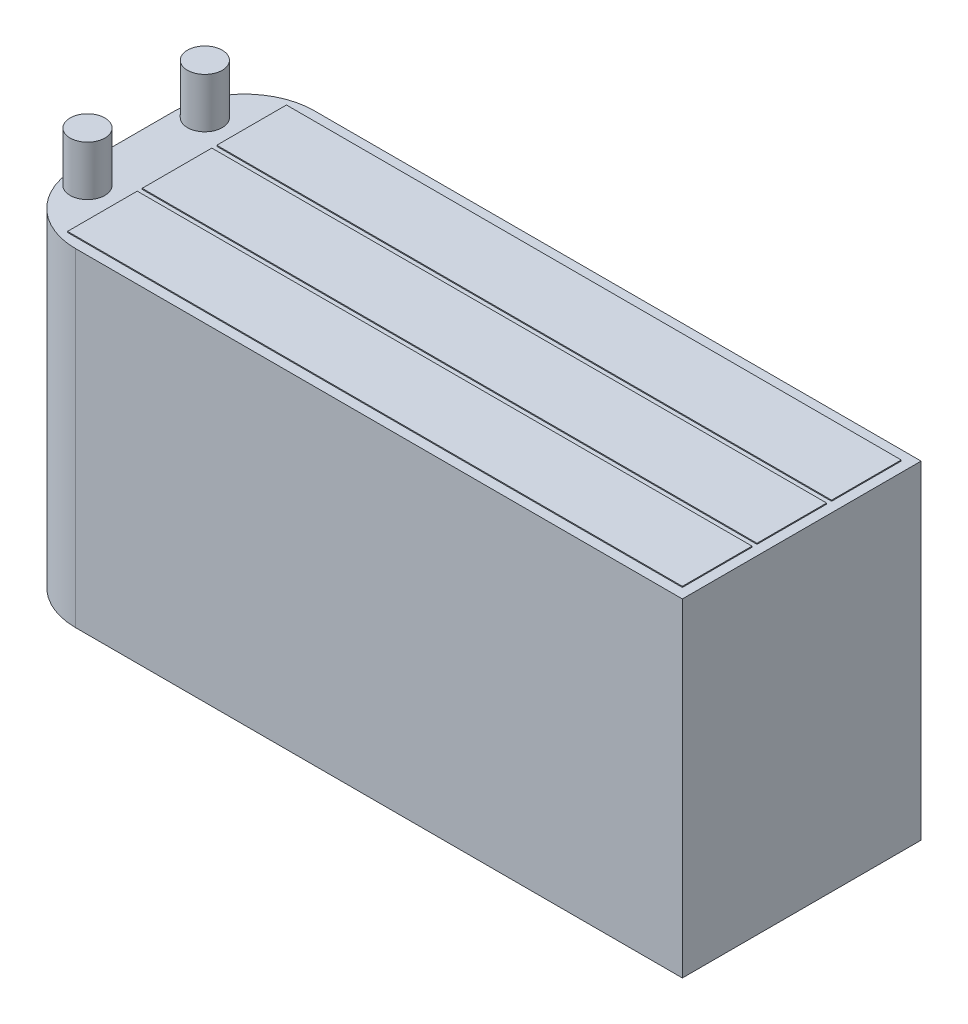
ISO-10303-21;
HEADER;
FILE_DESCRIPTION(('STEP AP214'),'2;1');
FILE_NAME('part.step','',(''),(''),'','','');
FILE_SCHEMA(('AUTOMOTIVE_DESIGN { 1 0 10303 214 1 1 1 1 }'));
ENDSEC;
DATA;
#1=APPLICATION_CONTEXT('core data for automotive mechanical design processes');
#2=APPLICATION_PROTOCOL_DEFINITION('international standard','automotive_design',2000,#1);
#3=PRODUCT_CONTEXT('',#1,'mechanical');
#4=PRODUCT('Part','Part','',(#3));
#5=PRODUCT_RELATED_PRODUCT_CATEGORY('part','',(#4));
#6=PRODUCT_DEFINITION_FORMATION('','',#4);
#7=PRODUCT_DEFINITION_CONTEXT('part definition',#1,'design');
#8=PRODUCT_DEFINITION('design','',#6,#7);
#9=PRODUCT_DEFINITION_SHAPE('','',#8);
#10=(LENGTH_UNIT() NAMED_UNIT(*) SI_UNIT(.MILLI.,.METRE.));
#11=(NAMED_UNIT(*) PLANE_ANGLE_UNIT() SI_UNIT($,.RADIAN.));
#12=(NAMED_UNIT(*) SI_UNIT($,.STERADIAN.) SOLID_ANGLE_UNIT());
#13=UNCERTAINTY_MEASURE_WITH_UNIT(LENGTH_MEASURE(1.E-05),#10,'distance_accuracy_value','');
#14=(GEOMETRIC_REPRESENTATION_CONTEXT(3) GLOBAL_UNCERTAINTY_ASSIGNED_CONTEXT((#13)) GLOBAL_UNIT_ASSIGNED_CONTEXT((#10,
#11,#12)) REPRESENTATION_CONTEXT('',''));
#15=CARTESIAN_POINT('',(0.,0.,0.));
#16=DIRECTION('',(0.,0.,1.));
#17=DIRECTION('',(1.,0.,0.));
#18=AXIS2_PLACEMENT_3D('',#15,#16,#17);
#19=CARTESIAN_POINT('',(33.,-16.6,1.));
#20=DIRECTION('',(-1.,0.,0.));
#21=DIRECTION('',(0.,0.,1.));
#22=AXIS2_PLACEMENT_3D('',#19,#20,#21);
#23=PLANE('',#22);
#24=DIRECTION('',(0.,0.,-1.));
#25=VECTOR('',#24,1.);
#26=CARTESIAN_POINT('',(33.,-16.5,1.));
#27=LINE('',#26,#25);
#28=CARTESIAN_POINT('',(33.,-16.5,8.));
#29=VERTEX_POINT('',#28);
#30=CARTESIAN_POINT('',(33.,-16.5,1.));
#31=VERTEX_POINT('',#30);
#32=EDGE_CURVE('E120',#29,#31,#27,.T.);
#33=ORIENTED_EDGE('',*,*,#32,.F.);
#34=DIRECTION('',(0.,1.,0.));
#35=VECTOR('',#34,1.);
#36=CARTESIAN_POINT('',(33.,-16.6,8.));
#37=LINE('',#36,#35);
#38=CARTESIAN_POINT('',(33.,-16.6,8.));
#39=VERTEX_POINT('',#38);
#40=EDGE_CURVE('E116',#39,#29,#37,.T.);
#41=ORIENTED_EDGE('',*,*,#40,.F.);
#42=DIRECTION('',(0.,0.,-1.));
#43=VECTOR('',#42,1.);
#44=CARTESIAN_POINT('',(33.,-16.6,1.));
#45=LINE('',#44,#43);
#46=CARTESIAN_POINT('',(33.,-16.6,1.));
#47=VERTEX_POINT('',#46);
#48=EDGE_CURVE('E113',#39,#47,#45,.T.);
#49=ORIENTED_EDGE('',*,*,#48,.T.);
#50=DIRECTION('',(0.,1.,0.));
#51=VECTOR('',#50,1.);
#52=CARTESIAN_POINT('',(33.,-16.6,1.));
#53=LINE('',#52,#51);
#54=EDGE_CURVE('E12',#47,#31,#53,.T.);
#55=ORIENTED_EDGE('',*,*,#54,.T.);
#56=EDGE_LOOP('',(#33,#41,#49,#55));
#57=FACE_BOUND('',#56,.T.);
#58=ADVANCED_FACE('F53',(#57),#23,.F.);
#59=CARTESIAN_POINT('',(33.,-16.6,1.));
#60=DIRECTION('',(0.,0.,1.));
#61=DIRECTION('',(1.,0.,0.));
#62=AXIS2_PLACEMENT_3D('',#59,#60,#61);
#63=PLANE('',#62);
#64=DIRECTION('',(-1.,0.,0.));
#65=VECTOR('',#64,1.);
#66=CARTESIAN_POINT('',(33.,-16.5,1.));
#67=LINE('',#66,#65);
#68=CARTESIAN_POINT('',(-28.7999999999999,-16.5,1.));
#69=VERTEX_POINT('',#68);
#70=EDGE_CURVE('E117',#31,#69,#67,.T.);
#71=ORIENTED_EDGE('',*,*,#70,.F.);
#72=ORIENTED_EDGE('',*,*,#54,.F.);
#73=DIRECTION('',(-1.,0.,0.));
#74=VECTOR('',#73,1.);
#75=CARTESIAN_POINT('',(33.,-16.6,1.));
#76=LINE('',#75,#74);
#77=CARTESIAN_POINT('',(-28.7999999999999,-16.6,1.));
#78=VERTEX_POINT('',#77);
#79=EDGE_CURVE('E92',#47,#78,#76,.T.);
#80=ORIENTED_EDGE('',*,*,#79,.T.);
#81=DIRECTION('',(0.,1.,0.));
#82=VECTOR('',#81,1.);
#83=CARTESIAN_POINT('',(-28.7999999999999,-16.6,1.));
#84=LINE('',#83,#82);
#85=EDGE_CURVE('E65',#78,#69,#84,.T.);
#86=ORIENTED_EDGE('',*,*,#85,.T.);
#87=EDGE_LOOP('',(#71,#72,#80,#86));
#88=FACE_BOUND('',#87,.T.);
#89=ADVANCED_FACE('F110',(#88),#63,.F.);
#90=CARTESIAN_POINT('',(-28.7999999999999,-16.6,1.));
#91=DIRECTION('',(1.,0.,0.));
#92=DIRECTION('',(0.,0.,-1.));
#93=AXIS2_PLACEMENT_3D('',#90,#91,#92);
#94=PLANE('',#93);
#95=DIRECTION('',(0.,0.,1.));
#96=VECTOR('',#95,1.);
#97=CARTESIAN_POINT('',(-28.7999999999999,-16.5,1.));
#98=LINE('',#97,#96);
#99=CARTESIAN_POINT('',(-28.7999999999999,-16.5,8.));
#100=VERTEX_POINT('',#99);
#101=EDGE_CURVE('E102',#69,#100,#98,.T.);
#102=ORIENTED_EDGE('',*,*,#101,.F.);
#103=ORIENTED_EDGE('',*,*,#85,.F.);
#104=DIRECTION('',(0.,0.,1.));
#105=VECTOR('',#104,1.);
#106=CARTESIAN_POINT('',(-28.7999999999999,-16.6,1.));
#107=LINE('',#106,#105);
#108=CARTESIAN_POINT('',(-28.7999999999999,-16.6,8.));
#109=VERTEX_POINT('',#108);
#110=EDGE_CURVE('E97',#78,#109,#107,.T.);
#111=ORIENTED_EDGE('',*,*,#110,.T.);
#112=DIRECTION('',(0.,1.,0.));
#113=VECTOR('',#112,1.);
#114=CARTESIAN_POINT('',(-28.7999999999999,-16.6,8.));
#115=LINE('',#114,#113);
#116=EDGE_CURVE('E106',#109,#100,#115,.T.);
#117=ORIENTED_EDGE('',*,*,#116,.T.);
#118=EDGE_LOOP('',(#102,#103,#111,#117));
#119=FACE_BOUND('',#118,.T.);
#120=ADVANCED_FACE('F104',(#119),#94,.F.);
#121=CARTESIAN_POINT('',(33.,-16.6,8.));
#122=DIRECTION('',(0.,0.,-1.));
#123=DIRECTION('',(-1.,0.,0.));
#124=AXIS2_PLACEMENT_3D('',#121,#122,#123);
#125=PLANE('',#124);
#126=DIRECTION('',(1.,0.,0.));
#127=VECTOR('',#126,1.);
#128=CARTESIAN_POINT('',(33.,-16.5,8.));
#129=LINE('',#128,#127);
#130=EDGE_CURVE('E84',#100,#29,#129,.T.);
#131=ORIENTED_EDGE('',*,*,#130,.F.);
#132=ORIENTED_EDGE('',*,*,#116,.F.);
#133=DIRECTION('',(1.,0.,0.));
#134=VECTOR('',#133,1.);
#135=CARTESIAN_POINT('',(33.,-16.6,8.));
#136=LINE('',#135,#134);
#137=EDGE_CURVE('E67',#109,#39,#136,.T.);
#138=ORIENTED_EDGE('',*,*,#137,.T.);
#139=ORIENTED_EDGE('',*,*,#40,.T.);
#140=EDGE_LOOP('',(#131,#132,#138,#139));
#141=FACE_BOUND('',#140,.T.);
#142=ADVANCED_FACE('F127',(#141),#125,.F.);
#143=CARTESIAN_POINT('',(0.,-16.6,0.));
#144=DIRECTION('',(0.,1.,0.));
#145=DIRECTION('',(0.,0.,-1.));
#146=AXIS2_PLACEMENT_3D('',#143,#144,#145);
#147=PLANE('',#146);
#148=ORIENTED_EDGE('',*,*,#48,.F.);
#149=ORIENTED_EDGE('',*,*,#137,.F.);
#150=ORIENTED_EDGE('',*,*,#110,.F.);
#151=ORIENTED_EDGE('',*,*,#79,.F.);
#152=EDGE_LOOP('',(#148,#149,#150,#151));
#153=FACE_BOUND('',#152,.T.);
#154=ADVANCED_FACE('F96',(#153),#147,.F.);
#155=CARTESIAN_POINT('',(0.,-16.5,0.));
#156=DIRECTION('',(0.,1.,0.));
#157=DIRECTION('',(0.,0.,-1.));
#158=AXIS2_PLACEMENT_3D('',#155,#156,#157);
#159=PLANE('',#158);
#160=ORIENTED_EDGE('',*,*,#32,.T.);
#161=ORIENTED_EDGE('',*,*,#70,.T.);
#162=ORIENTED_EDGE('',*,*,#101,.T.);
#163=ORIENTED_EDGE('',*,*,#130,.T.);
#164=EDGE_LOOP('',(#160,#161,#162,#163));
#165=FACE_BOUND('',#164,.T.);
#166=ADVANCED_FACE('F122',(#165),#159,.T.);
#167=CLOSED_SHELL('',(#58,#89,#120,#142,#154,#166));
#168=MANIFOLD_SOLID_BREP('B2',#167);
#169=CARTESIAN_POINT('',(33.,-16.6,8.5));
#170=DIRECTION('',(-1.,0.,0.));
#171=DIRECTION('',(0.,0.,1.));
#172=AXIS2_PLACEMENT_3D('',#169,#170,#171);
#173=PLANE('',#172);
#174=DIRECTION('',(0.,0.,-1.));
#175=VECTOR('',#174,1.);
#176=CARTESIAN_POINT('',(33.,-16.5,8.5));
#177=LINE('',#176,#175);
#178=CARTESIAN_POINT('',(33.,-16.5,15.5));
#179=VERTEX_POINT('',#178);
#180=CARTESIAN_POINT('',(33.,-16.5,8.5));
#181=VERTEX_POINT('',#180);
#182=EDGE_CURVE('E278',#179,#181,#177,.T.);
#183=ORIENTED_EDGE('',*,*,#182,.F.);
#184=DIRECTION('',(0.,1.,0.));
#185=VECTOR('',#184,1.);
#186=CARTESIAN_POINT('',(33.,-16.6,15.5));
#187=LINE('',#186,#185);
#188=CARTESIAN_POINT('',(33.,-16.6,15.5));
#189=VERTEX_POINT('',#188);
#190=EDGE_CURVE('E277',#189,#179,#187,.T.);
#191=ORIENTED_EDGE('',*,*,#190,.F.);
#192=DIRECTION('',(0.,0.,-1.));
#193=VECTOR('',#192,1.);
#194=CARTESIAN_POINT('',(33.,-16.6,8.5));
#195=LINE('',#194,#193);
#196=CARTESIAN_POINT('',(33.,-16.6,8.5));
#197=VERTEX_POINT('',#196);
#198=EDGE_CURVE('E273',#189,#197,#195,.T.);
#199=ORIENTED_EDGE('',*,*,#198,.T.);
#200=DIRECTION('',(0.,1.,0.));
#201=VECTOR('',#200,1.);
#202=CARTESIAN_POINT('',(33.,-16.6,8.5));
#203=LINE('',#202,#201);
#204=EDGE_CURVE('E55',#197,#181,#203,.T.);
#205=ORIENTED_EDGE('',*,*,#204,.T.);
#206=EDGE_LOOP('',(#183,#191,#199,#205));
#207=FACE_BOUND('',#206,.T.);
#208=ADVANCED_FACE('F219',(#207),#173,.F.);
#209=CARTESIAN_POINT('',(33.,-16.6,8.5));
#210=DIRECTION('',(0.,0.,1.));
#211=DIRECTION('',(1.,0.,0.));
#212=AXIS2_PLACEMENT_3D('',#209,#210,#211);
#213=PLANE('',#212);
#214=DIRECTION('',(-1.,0.,0.));
#215=VECTOR('',#214,1.);
#216=CARTESIAN_POINT('',(33.,-16.5,8.5));
#217=LINE('',#216,#215);
#218=CARTESIAN_POINT('',(-28.7999999999999,-16.5,8.5));
#219=VERTEX_POINT('',#218);
#220=EDGE_CURVE('E282',#181,#219,#217,.T.);
#221=ORIENTED_EDGE('',*,*,#220,.F.);
#222=ORIENTED_EDGE('',*,*,#204,.F.);
#223=DIRECTION('',(-1.,0.,0.));
#224=VECTOR('',#223,1.);
#225=CARTESIAN_POINT('',(33.,-16.6,8.5));
#226=LINE('',#225,#224);
#227=CARTESIAN_POINT('',(-28.7999999999999,-16.6,8.5));
#228=VERTEX_POINT('',#227);
#229=EDGE_CURVE('E257',#197,#228,#226,.T.);
#230=ORIENTED_EDGE('',*,*,#229,.T.);
#231=DIRECTION('',(0.,1.,0.));
#232=VECTOR('',#231,1.);
#233=CARTESIAN_POINT('',(-28.7999999999999,-16.6,8.5));
#234=LINE('',#233,#232);
#235=EDGE_CURVE('E225',#228,#219,#234,.T.);
#236=ORIENTED_EDGE('',*,*,#235,.T.);
#237=EDGE_LOOP('',(#221,#222,#230,#236));
#238=FACE_BOUND('',#237,.T.);
#239=ADVANCED_FACE('F271',(#238),#213,.F.);
#240=CARTESIAN_POINT('',(-28.7999999999999,-16.6,8.5));
#241=DIRECTION('',(1.,0.,0.));
#242=DIRECTION('',(0.,0.,-1.));
#243=AXIS2_PLACEMENT_3D('',#240,#241,#242);
#244=PLANE('',#243);
#245=DIRECTION('',(0.,0.,1.));
#246=VECTOR('',#245,1.);
#247=CARTESIAN_POINT('',(-28.7999999999999,-16.5,8.5));
#248=LINE('',#247,#246);
#249=CARTESIAN_POINT('',(-28.7999999999999,-16.5,15.5));
#250=VERTEX_POINT('',#249);
#251=EDGE_CURVE('E270',#219,#250,#248,.T.);
#252=ORIENTED_EDGE('',*,*,#251,.F.);
#253=ORIENTED_EDGE('',*,*,#235,.F.);
#254=DIRECTION('',(0.,0.,1.));
#255=VECTOR('',#254,1.);
#256=CARTESIAN_POINT('',(-28.7999999999999,-16.6,8.5));
#257=LINE('',#256,#255);
#258=CARTESIAN_POINT('',(-28.7999999999999,-16.6,15.5));
#259=VERTEX_POINT('',#258);
#260=EDGE_CURVE('E259',#228,#259,#257,.T.);
#261=ORIENTED_EDGE('',*,*,#260,.T.);
#262=DIRECTION('',(0.,1.,0.));
#263=VECTOR('',#262,1.);
#264=CARTESIAN_POINT('',(-28.7999999999999,-16.6,15.5));
#265=LINE('',#264,#263);
#266=EDGE_CURVE('E269',#259,#250,#265,.T.);
#267=ORIENTED_EDGE('',*,*,#266,.T.);
#268=EDGE_LOOP('',(#252,#253,#261,#267));
#269=FACE_BOUND('',#268,.T.);
#270=ADVANCED_FACE('F266',(#269),#244,.F.);
#271=CARTESIAN_POINT('',(33.,-16.6,15.5));
#272=DIRECTION('',(0.,0.,-1.));
#273=DIRECTION('',(-1.,0.,0.));
#274=AXIS2_PLACEMENT_3D('',#271,#272,#273);
#275=PLANE('',#274);
#276=DIRECTION('',(1.,0.,0.));
#277=VECTOR('',#276,1.);
#278=CARTESIAN_POINT('',(33.,-16.5,15.5));
#279=LINE('',#278,#277);
#280=EDGE_CURVE('E248',#250,#179,#279,.T.);
#281=ORIENTED_EDGE('',*,*,#280,.F.);
#282=ORIENTED_EDGE('',*,*,#266,.F.);
#283=DIRECTION('',(1.,0.,0.));
#284=VECTOR('',#283,1.);
#285=CARTESIAN_POINT('',(33.,-16.6,15.5));
#286=LINE('',#285,#284);
#287=EDGE_CURVE('E235',#259,#189,#286,.T.);
#288=ORIENTED_EDGE('',*,*,#287,.T.);
#289=ORIENTED_EDGE('',*,*,#190,.T.);
#290=EDGE_LOOP('',(#281,#282,#288,#289));
#291=FACE_BOUND('',#290,.T.);
#292=ADVANCED_FACE('F288',(#291),#275,.F.);
#293=CARTESIAN_POINT('',(0.,-16.6,0.));
#294=DIRECTION('',(0.,1.,0.));
#295=DIRECTION('',(0.,0.,-1.));
#296=AXIS2_PLACEMENT_3D('',#293,#294,#295);
#297=PLANE('',#296);
#298=ORIENTED_EDGE('',*,*,#198,.F.);
#299=ORIENTED_EDGE('',*,*,#287,.F.);
#300=ORIENTED_EDGE('',*,*,#260,.F.);
#301=ORIENTED_EDGE('',*,*,#229,.F.);
#302=EDGE_LOOP('',(#298,#299,#300,#301));
#303=FACE_BOUND('',#302,.T.);
#304=ADVANCED_FACE('F265',(#303),#297,.F.);
#305=CARTESIAN_POINT('',(0.,-16.5,0.));
#306=DIRECTION('',(0.,1.,0.));
#307=DIRECTION('',(0.,0.,-1.));
#308=AXIS2_PLACEMENT_3D('',#305,#306,#307);
#309=PLANE('',#308);
#310=ORIENTED_EDGE('',*,*,#182,.T.);
#311=ORIENTED_EDGE('',*,*,#220,.T.);
#312=ORIENTED_EDGE('',*,*,#251,.T.);
#313=ORIENTED_EDGE('',*,*,#280,.T.);
#314=EDGE_LOOP('',(#310,#311,#312,#313));
#315=FACE_BOUND('',#314,.T.);
#316=ADVANCED_FACE('F287',(#315),#309,.T.);
#317=CLOSED_SHELL('',(#208,#239,#270,#292,#304,#316));
#318=MANIFOLD_SOLID_BREP('B6',#317);
#319=CARTESIAN_POINT('',(-28.7999999999999,-16.6,16.));
#320=DIRECTION('',(1.,0.,0.));
#321=DIRECTION('',(0.,0.,-1.));
#322=AXIS2_PLACEMENT_3D('',#319,#320,#321);
#323=PLANE('',#322);
#324=DIRECTION('',(0.,0.,1.));
#325=VECTOR('',#324,1.);
#326=CARTESIAN_POINT('',(-28.7999999999999,-16.5,16.));
#327=LINE('',#326,#325);
#328=CARTESIAN_POINT('',(-28.7999999999999,-16.5,16.));
#329=VERTEX_POINT('',#328);
#330=CARTESIAN_POINT('',(-28.7999999999999,-16.5,23.));
#331=VERTEX_POINT('',#330);
#332=EDGE_CURVE('E444',#329,#331,#327,.T.);
#333=ORIENTED_EDGE('',*,*,#332,.F.);
#334=DIRECTION('',(0.,1.,0.));
#335=VECTOR('',#334,1.);
#336=CARTESIAN_POINT('',(-28.7999999999999,-16.6,16.));
#337=LINE('',#336,#335);
#338=CARTESIAN_POINT('',(-28.7999999999999,-16.6,16.));
#339=VERTEX_POINT('',#338);
#340=EDGE_CURVE('E438',#339,#329,#337,.T.);
#341=ORIENTED_EDGE('',*,*,#340,.F.);
#342=DIRECTION('',(0.,0.,1.));
#343=VECTOR('',#342,1.);
#344=CARTESIAN_POINT('',(-28.7999999999999,-16.6,16.));
#345=LINE('',#344,#343);
#346=CARTESIAN_POINT('',(-28.7999999999999,-16.6,23.));
#347=VERTEX_POINT('',#346);
#348=EDGE_CURVE('E433',#339,#347,#345,.T.);
#349=ORIENTED_EDGE('',*,*,#348,.T.);
#350=DIRECTION('',(0.,1.,0.));
#351=VECTOR('',#350,1.);
#352=CARTESIAN_POINT('',(-28.7999999999999,-16.6,23.));
#353=LINE('',#352,#351);
#354=EDGE_CURVE('E211',#347,#331,#353,.T.);
#355=ORIENTED_EDGE('',*,*,#354,.T.);
#356=EDGE_LOOP('',(#333,#341,#349,#355));
#357=FACE_BOUND('',#356,.T.);
#358=ADVANCED_FACE('F376',(#357),#323,.F.);
#359=CARTESIAN_POINT('',(-28.7999999999999,-16.6,23.));
#360=DIRECTION('',(0.,0.,-1.));
#361=DIRECTION('',(-1.,0.,0.));
#362=AXIS2_PLACEMENT_3D('',#359,#360,#361);
#363=PLANE('',#362);
#364=DIRECTION('',(1.,0.,0.));
#365=VECTOR('',#364,1.);
#366=CARTESIAN_POINT('',(-28.7999999999999,-16.5,23.));
#367=LINE('',#366,#365);
#368=CARTESIAN_POINT('',(33.,-16.5,23.));
#369=VERTEX_POINT('',#368);
#370=EDGE_CURVE('E445',#331,#369,#367,.T.);
#371=ORIENTED_EDGE('',*,*,#370,.F.);
#372=ORIENTED_EDGE('',*,*,#354,.F.);
#373=DIRECTION('',(1.,0.,0.));
#374=VECTOR('',#373,1.);
#375=CARTESIAN_POINT('',(-28.7999999999999,-16.6,23.));
#376=LINE('',#375,#374);
#377=CARTESIAN_POINT('',(33.,-16.6,23.));
#378=VERTEX_POINT('',#377);
#379=EDGE_CURVE('E417',#347,#378,#376,.T.);
#380=ORIENTED_EDGE('',*,*,#379,.T.);
#381=DIRECTION('',(0.,1.,0.));
#382=VECTOR('',#381,1.);
#383=CARTESIAN_POINT('',(33.,-16.6,23.));
#384=LINE('',#383,#382);
#385=EDGE_CURVE('E387',#378,#369,#384,.T.);
#386=ORIENTED_EDGE('',*,*,#385,.T.);
#387=EDGE_LOOP('',(#371,#372,#380,#386));
#388=FACE_BOUND('',#387,.T.);
#389=ADVANCED_FACE('F434',(#388),#363,.F.);
#390=CARTESIAN_POINT('',(33.,-16.6,16.));
#391=DIRECTION('',(-1.,0.,0.));
#392=DIRECTION('',(0.,0.,1.));
#393=AXIS2_PLACEMENT_3D('',#390,#391,#392);
#394=PLANE('',#393);
#395=DIRECTION('',(0.,0.,-1.));
#396=VECTOR('',#395,1.);
#397=CARTESIAN_POINT('',(33.,-16.5,16.));
#398=LINE('',#397,#396);
#399=CARTESIAN_POINT('',(33.,-16.5,16.));
#400=VERTEX_POINT('',#399);
#401=EDGE_CURVE('E428',#369,#400,#398,.T.);
#402=ORIENTED_EDGE('',*,*,#401,.F.);
#403=ORIENTED_EDGE('',*,*,#385,.F.);
#404=DIRECTION('',(0.,0.,-1.));
#405=VECTOR('',#404,1.);
#406=CARTESIAN_POINT('',(33.,-16.6,16.));
#407=LINE('',#406,#405);
#408=CARTESIAN_POINT('',(33.,-16.6,16.));
#409=VERTEX_POINT('',#408);
#410=EDGE_CURVE('E425',#378,#409,#407,.T.);
#411=ORIENTED_EDGE('',*,*,#410,.T.);
#412=DIRECTION('',(0.,1.,0.));
#413=VECTOR('',#412,1.);
#414=CARTESIAN_POINT('',(33.,-16.6,16.));
#415=LINE('',#414,#413);
#416=EDGE_CURVE('E435',#409,#400,#415,.T.);
#417=ORIENTED_EDGE('',*,*,#416,.T.);
#418=EDGE_LOOP('',(#402,#403,#411,#417));
#419=FACE_BOUND('',#418,.T.);
#420=ADVANCED_FACE('F427',(#419),#394,.F.);
#421=CARTESIAN_POINT('',(-28.7999999999999,-16.6,16.));
#422=DIRECTION('',(0.,0.,1.));
#423=DIRECTION('',(1.,0.,0.));
#424=AXIS2_PLACEMENT_3D('',#421,#422,#423);
#425=PLANE('',#424);
#426=DIRECTION('',(-1.,0.,0.));
#427=VECTOR('',#426,1.);
#428=CARTESIAN_POINT('',(-28.7999999999999,-16.5,16.));
#429=LINE('',#428,#427);
#430=EDGE_CURVE('E406',#400,#329,#429,.T.);
#431=ORIENTED_EDGE('',*,*,#430,.F.);
#432=ORIENTED_EDGE('',*,*,#416,.F.);
#433=DIRECTION('',(-1.,0.,0.));
#434=VECTOR('',#433,1.);
#435=CARTESIAN_POINT('',(-28.7999999999999,-16.6,16.));
#436=LINE('',#435,#434);
#437=EDGE_CURVE('E393',#409,#339,#436,.T.);
#438=ORIENTED_EDGE('',*,*,#437,.T.);
#439=ORIENTED_EDGE('',*,*,#340,.T.);
#440=EDGE_LOOP('',(#431,#432,#438,#439));
#441=FACE_BOUND('',#440,.T.);
#442=ADVANCED_FACE('F455',(#441),#425,.F.);
#443=CARTESIAN_POINT('',(0.,-16.6,0.));
#444=DIRECTION('',(0.,-1.,0.));
#445=DIRECTION('',(0.,0.,1.));
#446=AXIS2_PLACEMENT_3D('',#443,#444,#445);
#447=PLANE('',#446);
#448=ORIENTED_EDGE('',*,*,#348,.F.);
#449=ORIENTED_EDGE('',*,*,#437,.F.);
#450=ORIENTED_EDGE('',*,*,#410,.F.);
#451=ORIENTED_EDGE('',*,*,#379,.F.);
#452=EDGE_LOOP('',(#448,#449,#450,#451));
#453=FACE_BOUND('',#452,.T.);
#454=ADVANCED_FACE('F422',(#453),#447,.T.);
#455=CARTESIAN_POINT('',(0.,-16.5,0.));
#456=DIRECTION('',(0.,-1.,0.));
#457=DIRECTION('',(0.,0.,1.));
#458=AXIS2_PLACEMENT_3D('',#455,#456,#457);
#459=PLANE('',#458);
#460=ORIENTED_EDGE('',*,*,#332,.T.);
#461=ORIENTED_EDGE('',*,*,#370,.T.);
#462=ORIENTED_EDGE('',*,*,#401,.T.);
#463=ORIENTED_EDGE('',*,*,#430,.T.);
#464=EDGE_LOOP('',(#460,#461,#462,#463));
#465=FACE_BOUND('',#464,.T.);
#466=ADVANCED_FACE('F447',(#465),#459,.F.);
#467=CLOSED_SHELL('',(#358,#389,#420,#442,#454,#466));
#468=MANIFOLD_SOLID_BREP('B46',#467);
#469=CARTESIAN_POINT('',(-28.7999999999999,16.6,16.));
#470=DIRECTION('',(1.,0.,0.));
#471=DIRECTION('',(0.,0.,-1.));
#472=AXIS2_PLACEMENT_3D('',#469,#470,#471);
#473=PLANE('',#472);
#474=DIRECTION('',(0.,0.,1.));
#475=VECTOR('',#474,1.);
#476=CARTESIAN_POINT('',(-28.7999999999999,16.5,16.));
#477=LINE('',#476,#475);
#478=CARTESIAN_POINT('',(-28.7999999999999,16.5,16.));
#479=VERTEX_POINT('',#478);
#480=CARTESIAN_POINT('',(-28.7999999999999,16.5,23.));
#481=VERTEX_POINT('',#480);
#482=EDGE_CURVE('E601',#479,#481,#477,.T.);
#483=ORIENTED_EDGE('',*,*,#482,.T.);
#484=DIRECTION('',(0.,-1.,0.));
#485=VECTOR('',#484,1.);
#486=CARTESIAN_POINT('',(-28.7999999999999,16.6,23.));
#487=LINE('',#486,#485);
#488=CARTESIAN_POINT('',(-28.7999999999999,16.6,23.));
#489=VERTEX_POINT('',#488);
#490=EDGE_CURVE('E378',#489,#481,#487,.T.);
#491=ORIENTED_EDGE('',*,*,#490,.F.);
#492=DIRECTION('',(0.,0.,1.));
#493=VECTOR('',#492,1.);
#494=CARTESIAN_POINT('',(-28.7999999999999,16.6,16.));
#495=LINE('',#494,#493);
#496=CARTESIAN_POINT('',(-28.7999999999999,16.6,16.));
#497=VERTEX_POINT('',#496);
#498=EDGE_CURVE('E594',#497,#489,#495,.T.);
#499=ORIENTED_EDGE('',*,*,#498,.F.);
#500=DIRECTION('',(0.,-1.,0.));
#501=VECTOR('',#500,1.);
#502=CARTESIAN_POINT('',(-28.7999999999999,16.6,16.));
#503=LINE('',#502,#501);
#504=EDGE_CURVE('E600',#497,#479,#503,.T.);
#505=ORIENTED_EDGE('',*,*,#504,.T.);
#506=EDGE_LOOP('',(#483,#491,#499,#505));
#507=FACE_BOUND('',#506,.T.);
#508=ADVANCED_FACE('F538',(#507),#473,.F.);
#509=CARTESIAN_POINT('',(-28.7999999999999,16.6,23.));
#510=DIRECTION('',(0.,0.,-1.));
#511=DIRECTION('',(-1.,0.,0.));
#512=AXIS2_PLACEMENT_3D('',#509,#510,#511);
#513=PLANE('',#512);
#514=DIRECTION('',(1.,0.,0.));
#515=VECTOR('',#514,1.);
#516=CARTESIAN_POINT('',(-28.7999999999999,16.5,23.));
#517=LINE('',#516,#515);
#518=CARTESIAN_POINT('',(33.,16.5,23.));
#519=VERTEX_POINT('',#518);
#520=EDGE_CURVE('E592',#481,#519,#517,.T.);
#521=ORIENTED_EDGE('',*,*,#520,.T.);
#522=DIRECTION('',(0.,-1.,0.));
#523=VECTOR('',#522,1.);
#524=CARTESIAN_POINT('',(33.,16.6,23.));
#525=LINE('',#524,#523);
#526=CARTESIAN_POINT('',(33.,16.6,23.));
#527=VERTEX_POINT('',#526);
#528=EDGE_CURVE('E547',#527,#519,#525,.T.);
#529=ORIENTED_EDGE('',*,*,#528,.F.);
#530=DIRECTION('',(1.,0.,0.));
#531=VECTOR('',#530,1.);
#532=CARTESIAN_POINT('',(-28.7999999999999,16.6,23.));
#533=LINE('',#532,#531);
#534=EDGE_CURVE('E587',#489,#527,#533,.T.);
#535=ORIENTED_EDGE('',*,*,#534,.F.);
#536=ORIENTED_EDGE('',*,*,#490,.T.);
#537=EDGE_LOOP('',(#521,#529,#535,#536));
#538=FACE_BOUND('',#537,.T.);
#539=ADVANCED_FACE('F593',(#538),#513,.F.);
#540=CARTESIAN_POINT('',(33.,16.6,16.));
#541=DIRECTION('',(-1.,0.,0.));
#542=DIRECTION('',(0.,0.,1.));
#543=AXIS2_PLACEMENT_3D('',#540,#541,#542);
#544=PLANE('',#543);
#545=DIRECTION('',(0.,0.,-1.));
#546=VECTOR('',#545,1.);
#547=CARTESIAN_POINT('',(33.,16.5,16.));
#548=LINE('',#547,#546);
#549=CARTESIAN_POINT('',(33.,16.5,16.));
#550=VERTEX_POINT('',#549);
#551=EDGE_CURVE('E573',#519,#550,#548,.T.);
#552=ORIENTED_EDGE('',*,*,#551,.T.);
#553=DIRECTION('',(0.,-1.,0.));
#554=VECTOR('',#553,1.);
#555=CARTESIAN_POINT('',(33.,16.6,16.));
#556=LINE('',#555,#554);
#557=CARTESIAN_POINT('',(33.,16.6,16.));
#558=VERTEX_POINT('',#557);
#559=EDGE_CURVE('E598',#558,#550,#556,.T.);
#560=ORIENTED_EDGE('',*,*,#559,.F.);
#561=DIRECTION('',(0.,0.,-1.));
#562=VECTOR('',#561,1.);
#563=CARTESIAN_POINT('',(33.,16.6,16.));
#564=LINE('',#563,#562);
#565=EDGE_CURVE('E586',#527,#558,#564,.T.);
#566=ORIENTED_EDGE('',*,*,#565,.F.);
#567=ORIENTED_EDGE('',*,*,#528,.T.);
#568=EDGE_LOOP('',(#552,#560,#566,#567));
#569=FACE_BOUND('',#568,.T.);
#570=ADVANCED_FACE('F599',(#569),#544,.F.);
#571=CARTESIAN_POINT('',(-28.7999999999999,16.6,16.));
#572=DIRECTION('',(0.,0.,1.));
#573=DIRECTION('',(1.,0.,0.));
#574=AXIS2_PLACEMENT_3D('',#571,#572,#573);
#575=PLANE('',#574);
#576=DIRECTION('',(-1.,0.,0.));
#577=VECTOR('',#576,1.);
#578=CARTESIAN_POINT('',(-28.7999999999999,16.5,16.));
#579=LINE('',#578,#577);
#580=EDGE_CURVE('E578',#550,#479,#579,.T.);
#581=ORIENTED_EDGE('',*,*,#580,.T.);
#582=ORIENTED_EDGE('',*,*,#504,.F.);
#583=DIRECTION('',(-1.,0.,0.));
#584=VECTOR('',#583,1.);
#585=CARTESIAN_POINT('',(-28.7999999999999,16.6,16.));
#586=LINE('',#585,#584);
#587=EDGE_CURVE('E558',#558,#497,#586,.T.);
#588=ORIENTED_EDGE('',*,*,#587,.F.);
#589=ORIENTED_EDGE('',*,*,#559,.T.);
#590=EDGE_LOOP('',(#581,#582,#588,#589));
#591=FACE_BOUND('',#590,.T.);
#592=ADVANCED_FACE('F608',(#591),#575,.F.);
#593=CARTESIAN_POINT('',(0.,16.6,0.));
#594=DIRECTION('',(0.,1.,0.));
#595=DIRECTION('',(0.,0.,1.));
#596=AXIS2_PLACEMENT_3D('',#593,#594,#595);
#597=PLANE('',#596);
#598=ORIENTED_EDGE('',*,*,#498,.T.);
#599=ORIENTED_EDGE('',*,*,#534,.T.);
#600=ORIENTED_EDGE('',*,*,#565,.T.);
#601=ORIENTED_EDGE('',*,*,#587,.T.);
#602=EDGE_LOOP('',(#598,#599,#600,#601));
#603=FACE_BOUND('',#602,.T.);
#604=ADVANCED_FACE('F590',(#603),#597,.T.);
#605=CARTESIAN_POINT('',(0.,16.5,0.));
#606=DIRECTION('',(0.,1.,0.));
#607=DIRECTION('',(0.,0.,1.));
#608=AXIS2_PLACEMENT_3D('',#605,#606,#607);
#609=PLANE('',#608);
#610=ORIENTED_EDGE('',*,*,#482,.F.);
#611=ORIENTED_EDGE('',*,*,#580,.F.);
#612=ORIENTED_EDGE('',*,*,#551,.F.);
#613=ORIENTED_EDGE('',*,*,#520,.F.);
#614=EDGE_LOOP('',(#610,#611,#612,#613));
#615=FACE_BOUND('',#614,.T.);
#616=ADVANCED_FACE('F614',(#615),#609,.F.);
#617=CLOSED_SHELL('',(#508,#539,#570,#592,#604,#616));
#618=MANIFOLD_SOLID_BREP('B209',#617);
#619=CARTESIAN_POINT('',(33.,16.6,8.5));
#620=DIRECTION('',(-1.,0.,0.));
#621=DIRECTION('',(0.,0.,1.));
#622=AXIS2_PLACEMENT_3D('',#619,#620,#621);
#623=PLANE('',#622);
#624=DIRECTION('',(0.,0.,-1.));
#625=VECTOR('',#624,1.);
#626=CARTESIAN_POINT('',(33.,16.5,8.5));
#627=LINE('',#626,#625);
#628=CARTESIAN_POINT('',(33.,16.5,15.5));
#629=VERTEX_POINT('',#628);
#630=CARTESIAN_POINT('',(33.,16.5,8.5));
#631=VERTEX_POINT('',#630);
#632=EDGE_CURVE('E773',#629,#631,#627,.T.);
#633=ORIENTED_EDGE('',*,*,#632,.T.);
#634=DIRECTION('',(0.,-1.,0.));
#635=VECTOR('',#634,1.);
#636=CARTESIAN_POINT('',(33.,16.6,8.5));
#637=LINE('',#636,#635);
#638=CARTESIAN_POINT('',(33.,16.6,8.5));
#639=VERTEX_POINT('',#638);
#640=EDGE_CURVE('E539',#639,#631,#637,.T.);
#641=ORIENTED_EDGE('',*,*,#640,.F.);
#642=DIRECTION('',(0.,0.,-1.));
#643=VECTOR('',#642,1.);
#644=CARTESIAN_POINT('',(33.,16.6,8.5));
#645=LINE('',#644,#643);
#646=CARTESIAN_POINT('',(33.,16.6,15.5));
#647=VERTEX_POINT('',#646);
#648=EDGE_CURVE('E759',#647,#639,#645,.T.);
#649=ORIENTED_EDGE('',*,*,#648,.F.);
#650=DIRECTION('',(0.,-1.,0.));
#651=VECTOR('',#650,1.);
#652=CARTESIAN_POINT('',(33.,16.6,15.5));
#653=LINE('',#652,#651);
#654=EDGE_CURVE('E766',#647,#629,#653,.T.);
#655=ORIENTED_EDGE('',*,*,#654,.T.);
#656=EDGE_LOOP('',(#633,#641,#649,#655));
#657=FACE_BOUND('',#656,.T.);
#658=ADVANCED_FACE('F706',(#657),#623,.F.);
#659=CARTESIAN_POINT('',(33.,16.6,8.5));
#660=DIRECTION('',(0.,0.,1.));
#661=DIRECTION('',(1.,0.,0.));
#662=AXIS2_PLACEMENT_3D('',#659,#660,#661);
#663=PLANE('',#662);
#664=DIRECTION('',(-1.,0.,0.));
#665=VECTOR('',#664,1.);
#666=CARTESIAN_POINT('',(33.,16.5,8.5));
#667=LINE('',#666,#665);
#668=CARTESIAN_POINT('',(-28.7999999999999,16.5,8.5));
#669=VERTEX_POINT('',#668);
#670=EDGE_CURVE('E764',#631,#669,#667,.T.);
#671=ORIENTED_EDGE('',*,*,#670,.T.);
#672=DIRECTION('',(0.,-1.,0.));
#673=VECTOR('',#672,1.);
#674=CARTESIAN_POINT('',(-28.7999999999999,16.6,8.5));
#675=LINE('',#674,#673);
#676=CARTESIAN_POINT('',(-28.7999999999999,16.6,8.5));
#677=VERTEX_POINT('',#676);
#678=EDGE_CURVE('E716',#677,#669,#675,.T.);
#679=ORIENTED_EDGE('',*,*,#678,.F.);
#680=DIRECTION('',(-1.,0.,0.));
#681=VECTOR('',#680,1.);
#682=CARTESIAN_POINT('',(33.,16.6,8.5));
#683=LINE('',#682,#681);
#684=EDGE_CURVE('E754',#639,#677,#683,.T.);
#685=ORIENTED_EDGE('',*,*,#684,.F.);
#686=ORIENTED_EDGE('',*,*,#640,.T.);
#687=EDGE_LOOP('',(#671,#679,#685,#686));
#688=FACE_BOUND('',#687,.T.);
#689=ADVANCED_FACE('F765',(#688),#663,.F.);
#690=CARTESIAN_POINT('',(-28.7999999999999,16.6,8.5));
#691=DIRECTION('',(1.,0.,0.));
#692=DIRECTION('',(0.,0.,-1.));
#693=AXIS2_PLACEMENT_3D('',#690,#691,#692);
#694=PLANE('',#693);
#695=DIRECTION('',(0.,0.,1.));
#696=VECTOR('',#695,1.);
#697=CARTESIAN_POINT('',(-28.7999999999999,16.5,8.5));
#698=LINE('',#697,#696);
#699=CARTESIAN_POINT('',(-28.7999999999999,16.5,15.5));
#700=VERTEX_POINT('',#699);
#701=EDGE_CURVE('E744',#669,#700,#698,.T.);
#702=ORIENTED_EDGE('',*,*,#701,.T.);
#703=DIRECTION('',(0.,-1.,0.));
#704=VECTOR('',#703,1.);
#705=CARTESIAN_POINT('',(-28.7999999999999,16.6,15.5));
#706=LINE('',#705,#704);
#707=CARTESIAN_POINT('',(-28.7999999999999,16.6,15.5));
#708=VERTEX_POINT('',#707);
#709=EDGE_CURVE('E761',#708,#700,#706,.T.);
#710=ORIENTED_EDGE('',*,*,#709,.F.);
#711=DIRECTION('',(0.,0.,1.));
#712=VECTOR('',#711,1.);
#713=CARTESIAN_POINT('',(-28.7999999999999,16.6,8.5));
#714=LINE('',#713,#712);
#715=EDGE_CURVE('E760',#677,#708,#714,.T.);
#716=ORIENTED_EDGE('',*,*,#715,.F.);
#717=ORIENTED_EDGE('',*,*,#678,.T.);
#718=EDGE_LOOP('',(#702,#710,#716,#717));
#719=FACE_BOUND('',#718,.T.);
#720=ADVANCED_FACE('F763',(#719),#694,.F.);
#721=CARTESIAN_POINT('',(33.,16.6,15.5));
#722=DIRECTION('',(0.,0.,-1.));
#723=DIRECTION('',(-1.,0.,0.));
#724=AXIS2_PLACEMENT_3D('',#721,#722,#723);
#725=PLANE('',#724);
#726=DIRECTION('',(1.,0.,0.));
#727=VECTOR('',#726,1.);
#728=CARTESIAN_POINT('',(33.,16.5,15.5));
#729=LINE('',#728,#727);
#730=EDGE_CURVE('E749',#700,#629,#729,.T.);
#731=ORIENTED_EDGE('',*,*,#730,.T.);
#732=ORIENTED_EDGE('',*,*,#654,.F.);
#733=DIRECTION('',(1.,0.,0.));
#734=VECTOR('',#733,1.);
#735=CARTESIAN_POINT('',(33.,16.6,15.5));
#736=LINE('',#735,#734);
#737=EDGE_CURVE('E722',#708,#647,#736,.T.);
#738=ORIENTED_EDGE('',*,*,#737,.F.);
#739=ORIENTED_EDGE('',*,*,#709,.T.);
#740=EDGE_LOOP('',(#731,#732,#738,#739));
#741=FACE_BOUND('',#740,.T.);
#742=ADVANCED_FACE('F776',(#741),#725,.F.);
#743=CARTESIAN_POINT('',(0.,16.6,0.));
#744=DIRECTION('',(0.,-1.,0.));
#745=DIRECTION('',(0.,0.,-1.));
#746=AXIS2_PLACEMENT_3D('',#743,#744,#745);
#747=PLANE('',#746);
#748=ORIENTED_EDGE('',*,*,#648,.T.);
#749=ORIENTED_EDGE('',*,*,#684,.T.);
#750=ORIENTED_EDGE('',*,*,#715,.T.);
#751=ORIENTED_EDGE('',*,*,#737,.T.);
#752=EDGE_LOOP('',(#748,#749,#750,#751));
#753=FACE_BOUND('',#752,.T.);
#754=ADVANCED_FACE('F752',(#753),#747,.F.);
#755=CARTESIAN_POINT('',(0.,16.5,0.));
#756=DIRECTION('',(0.,-1.,0.));
#757=DIRECTION('',(0.,0.,-1.));
#758=AXIS2_PLACEMENT_3D('',#755,#756,#757);
#759=PLANE('',#758);
#760=ORIENTED_EDGE('',*,*,#632,.F.);
#761=ORIENTED_EDGE('',*,*,#730,.F.);
#762=ORIENTED_EDGE('',*,*,#701,.F.);
#763=ORIENTED_EDGE('',*,*,#670,.F.);
#764=EDGE_LOOP('',(#760,#761,#762,#763));
#765=FACE_BOUND('',#764,.T.);
#766=ADVANCED_FACE('F783',(#765),#759,.T.);
#767=CLOSED_SHELL('',(#658,#689,#720,#742,#754,#766));
#768=MANIFOLD_SOLID_BREP('B367',#767);
#769=CARTESIAN_POINT('',(33.,16.6,1.));
#770=DIRECTION('',(-1.,0.,0.));
#771=DIRECTION('',(0.,0.,1.));
#772=AXIS2_PLACEMENT_3D('',#769,#770,#771);
#773=PLANE('',#772);
#774=DIRECTION('',(0.,0.,-1.));
#775=VECTOR('',#774,1.);
#776=CARTESIAN_POINT('',(33.,16.5,1.));
#777=LINE('',#776,#775);
#778=CARTESIAN_POINT('',(33.,16.5,8.));
#779=VERTEX_POINT('',#778);
#780=CARTESIAN_POINT('',(33.,16.5,1.));
#781=VERTEX_POINT('',#780);
#782=EDGE_CURVE('E936',#779,#781,#777,.T.);
#783=ORIENTED_EDGE('',*,*,#782,.T.);
#784=DIRECTION('',(0.,-1.,0.));
#785=VECTOR('',#784,1.);
#786=CARTESIAN_POINT('',(33.,16.6,1.));
#787=LINE('',#786,#785);
#788=CARTESIAN_POINT('',(33.,16.6,1.));
#789=VERTEX_POINT('',#788);
#790=EDGE_CURVE('E708',#789,#781,#787,.T.);
#791=ORIENTED_EDGE('',*,*,#790,.F.);
#792=DIRECTION('',(0.,0.,-1.));
#793=VECTOR('',#792,1.);
#794=CARTESIAN_POINT('',(33.,16.6,1.));
#795=LINE('',#794,#793);
#796=CARTESIAN_POINT('',(33.,16.6,8.));
#797=VERTEX_POINT('',#796);
#798=EDGE_CURVE('E928',#797,#789,#795,.T.);
#799=ORIENTED_EDGE('',*,*,#798,.F.);
#800=DIRECTION('',(0.,-1.,0.));
#801=VECTOR('',#800,1.);
#802=CARTESIAN_POINT('',(33.,16.6,8.));
#803=LINE('',#802,#801);
#804=EDGE_CURVE('E935',#797,#779,#803,.T.);
#805=ORIENTED_EDGE('',*,*,#804,.T.);
#806=EDGE_LOOP('',(#783,#791,#799,#805));
#807=FACE_BOUND('',#806,.T.);
#808=ADVANCED_FACE('F874',(#807),#773,.F.);
#809=CARTESIAN_POINT('',(33.,16.6,1.));
#810=DIRECTION('',(0.,0.,1.));
#811=DIRECTION('',(1.,0.,0.));
#812=AXIS2_PLACEMENT_3D('',#809,#810,#811);
#813=PLANE('',#812);
#814=DIRECTION('',(-1.,0.,0.));
#815=VECTOR('',#814,1.);
#816=CARTESIAN_POINT('',(33.,16.5,1.));
#817=LINE('',#816,#815);
#818=CARTESIAN_POINT('',(-28.7999999999999,16.5,1.));
#819=VERTEX_POINT('',#818);
#820=EDGE_CURVE('E927',#781,#819,#817,.T.);
#821=ORIENTED_EDGE('',*,*,#820,.T.);
#822=DIRECTION('',(0.,-1.,0.));
#823=VECTOR('',#822,1.);
#824=CARTESIAN_POINT('',(-28.7999999999999,16.6,1.));
#825=LINE('',#824,#823);
#826=CARTESIAN_POINT('',(-28.7999999999999,16.6,1.));
#827=VERTEX_POINT('',#826);
#828=EDGE_CURVE('E884',#827,#819,#825,.T.);
#829=ORIENTED_EDGE('',*,*,#828,.F.);
#830=DIRECTION('',(-1.,0.,0.));
#831=VECTOR('',#830,1.);
#832=CARTESIAN_POINT('',(33.,16.6,1.));
#833=LINE('',#832,#831);
#834=EDGE_CURVE('E923',#789,#827,#833,.T.);
#835=ORIENTED_EDGE('',*,*,#834,.F.);
#836=ORIENTED_EDGE('',*,*,#790,.T.);
#837=EDGE_LOOP('',(#821,#829,#835,#836));
#838=FACE_BOUND('',#837,.T.);
#839=ADVANCED_FACE('F929',(#838),#813,.F.);
#840=CARTESIAN_POINT('',(-28.7999999999999,16.6,1.));
#841=DIRECTION('',(1.,0.,0.));
#842=DIRECTION('',(0.,0.,-1.));
#843=AXIS2_PLACEMENT_3D('',#840,#841,#842);
#844=PLANE('',#843);
#845=DIRECTION('',(0.,0.,1.));
#846=VECTOR('',#845,1.);
#847=CARTESIAN_POINT('',(-28.7999999999999,16.5,1.));
#848=LINE('',#847,#846);
#849=CARTESIAN_POINT('',(-28.7999999999999,16.5,8.));
#850=VERTEX_POINT('',#849);
#851=EDGE_CURVE('E906',#819,#850,#848,.T.);
#852=ORIENTED_EDGE('',*,*,#851,.T.);
#853=DIRECTION('',(0.,-1.,0.));
#854=VECTOR('',#853,1.);
#855=CARTESIAN_POINT('',(-28.7999999999999,16.6,8.));
#856=LINE('',#855,#854);
#857=CARTESIAN_POINT('',(-28.7999999999999,16.6,8.));
#858=VERTEX_POINT('',#857);
#859=EDGE_CURVE('E933',#858,#850,#856,.T.);
#860=ORIENTED_EDGE('',*,*,#859,.F.);
#861=DIRECTION('',(0.,0.,1.));
#862=VECTOR('',#861,1.);
#863=CARTESIAN_POINT('',(-28.7999999999999,16.6,1.));
#864=LINE('',#863,#862);
#865=EDGE_CURVE('E925',#827,#858,#864,.T.);
#866=ORIENTED_EDGE('',*,*,#865,.F.);
#867=ORIENTED_EDGE('',*,*,#828,.T.);
#868=EDGE_LOOP('',(#852,#860,#866,#867));
#869=FACE_BOUND('',#868,.T.);
#870=ADVANCED_FACE('F932',(#869),#844,.F.);
#871=CARTESIAN_POINT('',(33.,16.6,8.));
#872=DIRECTION('',(0.,0.,-1.));
#873=DIRECTION('',(-1.,0.,0.));
#874=AXIS2_PLACEMENT_3D('',#871,#872,#873);
#875=PLANE('',#874);
#876=DIRECTION('',(1.,0.,0.));
#877=VECTOR('',#876,1.);
#878=CARTESIAN_POINT('',(33.,16.5,8.));
#879=LINE('',#878,#877);
#880=EDGE_CURVE('E911',#850,#779,#879,.T.);
#881=ORIENTED_EDGE('',*,*,#880,.T.);
#882=ORIENTED_EDGE('',*,*,#804,.F.);
#883=DIRECTION('',(1.,0.,0.));
#884=VECTOR('',#883,1.);
#885=CARTESIAN_POINT('',(33.,16.6,8.));
#886=LINE('',#885,#884);
#887=EDGE_CURVE('E894',#858,#797,#886,.T.);
#888=ORIENTED_EDGE('',*,*,#887,.F.);
#889=ORIENTED_EDGE('',*,*,#859,.T.);
#890=EDGE_LOOP('',(#881,#882,#888,#889));
#891=FACE_BOUND('',#890,.T.);
#892=ADVANCED_FACE('F944',(#891),#875,.F.);
#893=CARTESIAN_POINT('',(0.,16.6,0.));
#894=DIRECTION('',(0.,-1.,0.));
#895=DIRECTION('',(0.,0.,-1.));
#896=AXIS2_PLACEMENT_3D('',#893,#894,#895);
#897=PLANE('',#896);
#898=ORIENTED_EDGE('',*,*,#798,.T.);
#899=ORIENTED_EDGE('',*,*,#834,.T.);
#900=ORIENTED_EDGE('',*,*,#865,.T.);
#901=ORIENTED_EDGE('',*,*,#887,.T.);
#902=EDGE_LOOP('',(#898,#899,#900,#901));
#903=FACE_BOUND('',#902,.T.);
#904=ADVANCED_FACE('F924',(#903),#897,.F.);
#905=CARTESIAN_POINT('',(0.,16.5,0.));
#906=DIRECTION('',(0.,-1.,0.));
#907=DIRECTION('',(0.,0.,-1.));
#908=AXIS2_PLACEMENT_3D('',#905,#906,#907);
#909=PLANE('',#908);
#910=ORIENTED_EDGE('',*,*,#782,.F.);
#911=ORIENTED_EDGE('',*,*,#880,.F.);
#912=ORIENTED_EDGE('',*,*,#851,.F.);
#913=ORIENTED_EDGE('',*,*,#820,.F.);
#914=EDGE_LOOP('',(#910,#911,#912,#913));
#915=FACE_BOUND('',#914,.T.);
#916=ADVANCED_FACE('F948',(#915),#909,.T.);
#917=CLOSED_SHELL('',(#808,#839,#870,#892,#904,#916));
#918=MANIFOLD_SOLID_BREP('B535',#917);
#919=CARTESIAN_POINT('',(34.,-16.5,24.));
#920=DIRECTION('',(-1.,0.,0.));
#921=DIRECTION('',(0.,0.,1.));
#922=AXIS2_PLACEMENT_3D('',#919,#920,#921);
#923=PLANE('',#922);
#924=DIRECTION('',(0.,1.,0.));
#925=VECTOR('',#924,1.);
#926=CARTESIAN_POINT('',(34.,-16.5,0.));
#927=LINE('',#926,#925);
#928=CARTESIAN_POINT('',(34.,-16.5,0.));
#929=VERTEX_POINT('',#928);
#930=CARTESIAN_POINT('',(34.,16.5,0.));
#931=VERTEX_POINT('',#930);
#932=EDGE_CURVE('E1110',#929,#931,#927,.T.);
#933=ORIENTED_EDGE('',*,*,#932,.T.);
#934=DIRECTION('',(0.,0.,-1.));
#935=VECTOR('',#934,1.);
#936=CARTESIAN_POINT('',(34.,16.5,24.));
#937=LINE('',#936,#935);
#938=CARTESIAN_POINT('',(34.,16.5,24.));
#939=VERTEX_POINT('',#938);
#940=EDGE_CURVE('E1087',#939,#931,#937,.T.);
#941=ORIENTED_EDGE('',*,*,#940,.F.);
#942=DIRECTION('',(0.,1.,0.));
#943=VECTOR('',#942,1.);
#944=CARTESIAN_POINT('',(34.,-16.5,24.));
#945=LINE('',#944,#943);
#946=CARTESIAN_POINT('',(34.,-16.5,24.));
#947=VERTEX_POINT('',#946);
#948=EDGE_CURVE('E1096',#947,#939,#945,.T.);
#949=ORIENTED_EDGE('',*,*,#948,.F.);
#950=DIRECTION('',(0.,0.,-1.));
#951=VECTOR('',#950,1.);
#952=CARTESIAN_POINT('',(34.,-16.5,24.));
#953=LINE('',#952,#951);
#954=EDGE_CURVE('E1166',#947,#929,#953,.T.);
#955=ORIENTED_EDGE('',*,*,#954,.T.);
#956=EDGE_LOOP('',(#933,#941,#949,#955));
#957=FACE_BOUND('',#956,.T.);
#958=ADVANCED_FACE('F1034',(#957),#923,.F.);
#959=CARTESIAN_POINT('',(-34.,16.5,24.));
#960=DIRECTION('',(0.,-1.,0.));
#961=DIRECTION('',(0.,0.,-1.));
#962=AXIS2_PLACEMENT_3D('',#959,#960,#961);
#963=PLANE('',#962);
#964=CARTESIAN_POINT('',(-31.9,16.5,17.9));
#965=DIRECTION('',(0.,-1.,0.));
#966=DIRECTION('',(0.,0.,-1.));
#967=AXIS2_PLACEMENT_3D('',#964,#965,#966);
#968=CIRCLE('',#967,1.75);
#969=CARTESIAN_POINT('',(-31.9,16.5,16.15));
#970=VERTEX_POINT('',#969);
#971=EDGE_CURVE('E873',#970,#970,#968,.F.);
#972=ORIENTED_EDGE('',*,*,#971,.F.);
#973=EDGE_LOOP('',(#972));
#974=FACE_BOUND('',#973,.T.);
#975=CARTESIAN_POINT('',(-31.9,16.5,6.1));
#976=DIRECTION('',(0.,-1.,0.));
#977=DIRECTION('',(0.,0.,-1.));
#978=AXIS2_PLACEMENT_3D('',#975,#976,#977);
#979=CIRCLE('',#978,1.75);
#980=CARTESIAN_POINT('',(-31.9,16.5,4.35));
#981=VERTEX_POINT('',#980);
#982=EDGE_CURVE('E1044',#981,#981,#979,.F.);
#983=ORIENTED_EDGE('',*,*,#982,.F.);
#984=EDGE_LOOP('',(#983));
#985=FACE_BOUND('',#984,.T.);
#986=DIRECTION('',(-1.,0.,0.));
#987=VECTOR('',#986,1.);
#988=CARTESIAN_POINT('',(-34.,16.5,0.));
#989=LINE('',#988,#987);
#990=CARTESIAN_POINT('',(-27.,16.5,0.));
#991=VERTEX_POINT('',#990);
#992=EDGE_CURVE('E1163',#931,#991,#989,.T.);
#993=ORIENTED_EDGE('',*,*,#992,.T.);
#994=CARTESIAN_POINT('',(-27.,16.5,7.));
#995=DIRECTION('',(0.,-1.,0.));
#996=DIRECTION('',(0.,0.,-1.));
#997=AXIS2_PLACEMENT_3D('',#994,#995,#996);
#998=CIRCLE('',#997,7.);
#999=CARTESIAN_POINT('',(-34.,16.5,7.));
#1000=VERTEX_POINT('',#999);
#1001=EDGE_CURVE('E1128',#991,#1000,#998,.F.);
#1002=ORIENTED_EDGE('',*,*,#1001,.T.);
#1003=DIRECTION('',(0.,0.,-1.));
#1004=VECTOR('',#1003,1.);
#1005=CARTESIAN_POINT('',(-34.,16.5,24.));
#1006=LINE('',#1005,#1004);
#1007=CARTESIAN_POINT('',(-34.,16.5,17.));
#1008=VERTEX_POINT('',#1007);
#1009=EDGE_CURVE('E1106',#1008,#1000,#1006,.T.);
#1010=ORIENTED_EDGE('',*,*,#1009,.F.);
#1011=CARTESIAN_POINT('',(-27.,16.5,17.));
#1012=DIRECTION('',(0.,-1.,0.));
#1013=DIRECTION('',(0.,0.,-1.));
#1014=AXIS2_PLACEMENT_3D('',#1011,#1012,#1013);
#1015=CIRCLE('',#1014,7.);
#1016=CARTESIAN_POINT('',(-27.,16.5,24.));
#1017=VERTEX_POINT('',#1016);
#1018=EDGE_CURVE('E1047',#1008,#1017,#1015,.F.);
#1019=ORIENTED_EDGE('',*,*,#1018,.T.);
#1020=DIRECTION('',(-1.,0.,0.));
#1021=VECTOR('',#1020,1.);
#1022=CARTESIAN_POINT('',(-34.,16.5,24.));
#1023=LINE('',#1022,#1021);
#1024=EDGE_CURVE('E1088',#939,#1017,#1023,.T.);
#1025=ORIENTED_EDGE('',*,*,#1024,.F.);
#1026=ORIENTED_EDGE('',*,*,#940,.T.);
#1027=EDGE_LOOP('',(#993,#1002,#1010,#1019,#1025,#1026));
#1028=FACE_BOUND('',#1027,.T.);
#1029=ADVANCED_FACE('F1086',(#974,#985,#1028),#963,.F.);
#1030=CARTESIAN_POINT('',(-34.,-16.5,24.));
#1031=DIRECTION('',(1.,0.,0.));
#1032=DIRECTION('',(0.,0.,-1.));
#1033=AXIS2_PLACEMENT_3D('',#1030,#1031,#1032);
#1034=PLANE('',#1033);
#1035=ORIENTED_EDGE('',*,*,#1009,.T.);
#1036=DIRECTION('',(0.,-1.,0.));
#1037=VECTOR('',#1036,1.);
#1038=CARTESIAN_POINT('',(-34.,-16.5,7.));
#1039=LINE('',#1038,#1037);
#1040=CARTESIAN_POINT('',(-34.,-16.5,7.));
#1041=VERTEX_POINT('',#1040);
#1042=EDGE_CURVE('E1112',#1000,#1041,#1039,.T.);
#1043=ORIENTED_EDGE('',*,*,#1042,.T.);
#1044=DIRECTION('',(0.,0.,-1.));
#1045=VECTOR('',#1044,1.);
#1046=CARTESIAN_POINT('',(-34.,-16.5,24.));
#1047=LINE('',#1046,#1045);
#1048=CARTESIAN_POINT('',(-34.,-16.5,17.));
#1049=VERTEX_POINT('',#1048);
#1050=EDGE_CURVE('E1111',#1049,#1041,#1047,.T.);
#1051=ORIENTED_EDGE('',*,*,#1050,.F.);
#1052=DIRECTION('',(0.,-1.,0.));
#1053=VECTOR('',#1052,1.);
#1054=CARTESIAN_POINT('',(-34.,-16.5,17.));
#1055=LINE('',#1054,#1053);
#1056=EDGE_CURVE('E1109',#1049,#1008,#1055,.F.);
#1057=ORIENTED_EDGE('',*,*,#1056,.T.);
#1058=EDGE_LOOP('',(#1035,#1043,#1051,#1057));
#1059=FACE_BOUND('',#1058,.T.);
#1060=ADVANCED_FACE('F1133',(#1059),#1034,.F.);
#1061=CARTESIAN_POINT('',(-34.,-16.5,24.));
#1062=DIRECTION('',(0.,1.,0.));
#1063=DIRECTION('',(0.,0.,1.));
#1064=AXIS2_PLACEMENT_3D('',#1061,#1062,#1063);
#1065=PLANE('',#1064);
#1066=ORIENTED_EDGE('',*,*,#1050,.T.);
#1067=CARTESIAN_POINT('',(-27.,-16.5,7.));
#1068=DIRECTION('',(0.,1.,0.));
#1069=DIRECTION('',(0.,0.,1.));
#1070=AXIS2_PLACEMENT_3D('',#1067,#1068,#1069);
#1071=CIRCLE('',#1070,7.);
#1072=CARTESIAN_POINT('',(-27.,-16.5,0.));
#1073=VERTEX_POINT('',#1072);
#1074=EDGE_CURVE('E1124',#1041,#1073,#1071,.F.);
#1075=ORIENTED_EDGE('',*,*,#1074,.T.);
#1076=DIRECTION('',(1.,0.,0.));
#1077=VECTOR('',#1076,1.);
#1078=CARTESIAN_POINT('',(-34.,-16.5,0.));
#1079=LINE('',#1078,#1077);
#1080=EDGE_CURVE('E1103',#1073,#929,#1079,.T.);
#1081=ORIENTED_EDGE('',*,*,#1080,.T.);
#1082=ORIENTED_EDGE('',*,*,#954,.F.);
#1083=DIRECTION('',(1.,0.,0.));
#1084=VECTOR('',#1083,1.);
#1085=CARTESIAN_POINT('',(-34.,-16.5,24.));
#1086=LINE('',#1085,#1084);
#1087=CARTESIAN_POINT('',(-27.,-16.5,24.));
#1088=VERTEX_POINT('',#1087);
#1089=EDGE_CURVE('E1094',#1088,#947,#1086,.T.);
#1090=ORIENTED_EDGE('',*,*,#1089,.F.);
#1091=CARTESIAN_POINT('',(-27.,-16.5,17.));
#1092=DIRECTION('',(0.,1.,0.));
#1093=DIRECTION('',(0.,0.,1.));
#1094=AXIS2_PLACEMENT_3D('',#1091,#1092,#1093);
#1095=CIRCLE('',#1094,7.);
#1096=EDGE_CURVE('E1117',#1088,#1049,#1095,.F.);
#1097=ORIENTED_EDGE('',*,*,#1096,.T.);
#1098=EDGE_LOOP('',(#1066,#1075,#1081,#1082,#1090,#1097));
#1099=FACE_BOUND('',#1098,.T.);
#1100=ADVANCED_FACE('F1145',(#1099),#1065,.F.);
#1101=CARTESIAN_POINT('',(0.,0.,24.));
#1102=DIRECTION('',(0.,0.,-1.));
#1103=DIRECTION('',(-1.,0.,0.));
#1104=AXIS2_PLACEMENT_3D('',#1101,#1102,#1103);
#1105=PLANE('',#1104);
#1106=ORIENTED_EDGE('',*,*,#1024,.T.);
#1107=DIRECTION('',(0.,-1.,0.));
#1108=VECTOR('',#1107,1.);
#1109=CARTESIAN_POINT('',(-27.,0.,24.));
#1110=LINE('',#1109,#1108);
#1111=EDGE_CURVE('E1126',#1017,#1088,#1110,.T.);
#1112=ORIENTED_EDGE('',*,*,#1111,.T.);
#1113=ORIENTED_EDGE('',*,*,#1089,.T.);
#1114=ORIENTED_EDGE('',*,*,#948,.T.);
#1115=EDGE_LOOP('',(#1106,#1112,#1113,#1114));
#1116=FACE_BOUND('',#1115,.T.);
#1117=ADVANCED_FACE('F1097',(#1116),#1105,.F.);
#1118=CARTESIAN_POINT('',(0.,0.,0.));
#1119=DIRECTION('',(0.,0.,-1.));
#1120=DIRECTION('',(-1.,0.,0.));
#1121=AXIS2_PLACEMENT_3D('',#1118,#1119,#1120);
#1122=PLANE('',#1121);
#1123=ORIENTED_EDGE('',*,*,#1080,.F.);
#1124=DIRECTION('',(0.,-1.,0.));
#1125=VECTOR('',#1124,1.);
#1126=CARTESIAN_POINT('',(-27.,16.5,0.));
#1127=LINE('',#1126,#1125);
#1128=EDGE_CURVE('E1057',#1073,#991,#1127,.F.);
#1129=ORIENTED_EDGE('',*,*,#1128,.T.);
#1130=ORIENTED_EDGE('',*,*,#992,.F.);
#1131=ORIENTED_EDGE('',*,*,#932,.F.);
#1132=EDGE_LOOP('',(#1123,#1129,#1130,#1131));
#1133=FACE_BOUND('',#1132,.T.);
#1134=ADVANCED_FACE('F1155',(#1133),#1122,.T.);
#1135=CARTESIAN_POINT('',(-27.,-16.5,7.));
#1136=DIRECTION('',(0.,1.,0.));
#1137=DIRECTION('',(0.,0.,1.));
#1138=AXIS2_PLACEMENT_3D('',#1135,#1136,#1137);
#1139=CYLINDRICAL_SURFACE('',#1138,7.);
#1140=ORIENTED_EDGE('',*,*,#1001,.F.);
#1141=ORIENTED_EDGE('',*,*,#1128,.F.);
#1142=ORIENTED_EDGE('',*,*,#1074,.F.);
#1143=ORIENTED_EDGE('',*,*,#1042,.F.);
#1144=EDGE_LOOP('',(#1140,#1141,#1142,#1143));
#1145=FACE_BOUND('',#1144,.T.);
#1146=ADVANCED_FACE('F1146',(#1145),#1139,.T.);
#1147=CARTESIAN_POINT('',(-27.,0.,17.));
#1148=DIRECTION('',(0.,-1.,0.));
#1149=DIRECTION('',(0.,0.,-1.));
#1150=AXIS2_PLACEMENT_3D('',#1147,#1148,#1149);
#1151=CYLINDRICAL_SURFACE('',#1150,7.);
#1152=ORIENTED_EDGE('',*,*,#1018,.F.);
#1153=ORIENTED_EDGE('',*,*,#1056,.F.);
#1154=ORIENTED_EDGE('',*,*,#1096,.F.);
#1155=ORIENTED_EDGE('',*,*,#1111,.F.);
#1156=EDGE_LOOP('',(#1152,#1153,#1154,#1155));
#1157=FACE_BOUND('',#1156,.T.);
#1158=ADVANCED_FACE('F1033',(#1157),#1151,.T.);
#1159=CARTESIAN_POINT('',(-31.9,21.5,6.1));
#1160=DIRECTION('',(0.,-1.,0.));
#1161=DIRECTION('',(0.,0.,-1.));
#1162=AXIS2_PLACEMENT_3D('',#1159,#1160,#1161);
#1163=CYLINDRICAL_SURFACE('',#1162,1.75);
#1164=CARTESIAN_POINT('',(-31.9,21.5,6.1));
#1165=DIRECTION('',(0.,1.,0.));
#1166=DIRECTION('',(0.,0.,1.));
#1167=AXIS2_PLACEMENT_3D('',#1164,#1165,#1166);
#1168=CIRCLE('',#1167,1.75);
#1169=CARTESIAN_POINT('',(-31.9,21.5,7.85));
#1170=VERTEX_POINT('',#1169);
#1171=EDGE_CURVE('E1171',#1170,#1170,#1168,.T.);
#1172=ORIENTED_EDGE('',*,*,#1171,.F.);
#1173=EDGE_LOOP('',(#1172));
#1174=FACE_BOUND('',#1173,.T.);
#1175=ORIENTED_EDGE('',*,*,#982,.T.);
#1176=EDGE_LOOP('',(#1175));
#1177=FACE_BOUND('',#1176,.T.);
#1178=ADVANCED_FACE('F1135',(#1174,#1177),#1163,.T.);
#1179=CARTESIAN_POINT('',(-31.9,21.5,6.1));
#1180=DIRECTION('',(0.,1.,0.));
#1181=DIRECTION('',(0.,0.,1.));
#1182=AXIS2_PLACEMENT_3D('',#1179,#1180,#1181);
#1183=PLANE('',#1182);
#1184=ORIENTED_EDGE('',*,*,#1171,.T.);
#1185=EDGE_LOOP('',(#1184));
#1186=FACE_BOUND('',#1185,.T.);
#1187=ADVANCED_FACE('F1190',(#1186),#1183,.T.);
#1188=CARTESIAN_POINT('',(-31.9,21.5,17.9));
#1189=DIRECTION('',(0.,-1.,0.));
#1190=DIRECTION('',(0.,0.,-1.));
#1191=AXIS2_PLACEMENT_3D('',#1188,#1189,#1190);
#1192=CYLINDRICAL_SURFACE('',#1191,1.75);
#1193=CARTESIAN_POINT('',(-31.9,21.5,17.9));
#1194=DIRECTION('',(0.,1.,0.));
#1195=DIRECTION('',(0.,0.,1.));
#1196=AXIS2_PLACEMENT_3D('',#1193,#1194,#1195);
#1197=CIRCLE('',#1196,1.75);
#1198=CARTESIAN_POINT('',(-31.9,21.5,19.65));
#1199=VERTEX_POINT('',#1198);
#1200=EDGE_CURVE('E1172',#1199,#1199,#1197,.T.);
#1201=ORIENTED_EDGE('',*,*,#1200,.F.);
#1202=EDGE_LOOP('',(#1201));
#1203=FACE_BOUND('',#1202,.T.);
#1204=ORIENTED_EDGE('',*,*,#971,.T.);
#1205=EDGE_LOOP('',(#1204));
#1206=FACE_BOUND('',#1205,.T.);
#1207=ADVANCED_FACE('F1181',(#1203,#1206),#1192,.T.);
#1208=CARTESIAN_POINT('',(-31.9,21.5,17.9));
#1209=DIRECTION('',(0.,1.,0.));
#1210=DIRECTION('',(0.,0.,1.));
#1211=AXIS2_PLACEMENT_3D('',#1208,#1209,#1210);
#1212=PLANE('',#1211);
#1213=ORIENTED_EDGE('',*,*,#1200,.T.);
#1214=EDGE_LOOP('',(#1213));
#1215=FACE_BOUND('',#1214,.T.);
#1216=ADVANCED_FACE('F1185',(#1215),#1212,.T.);
#1217=CLOSED_SHELL('',(#958,#1029,#1060,#1100,#1117,#1134,#1146,#1158,#1178,#1187,#1207,#1216));
#1218=MANIFOLD_SOLID_BREP('B696',#1217);
#1219=ADVANCED_BREP_SHAPE_REPRESENTATION('',(#18,#168,#318,#468,#618,#768,#918,#1218),#14);
#1220=SHAPE_DEFINITION_REPRESENTATION(#9,#1219);
ENDSEC;
END-ISO-10303-21;
